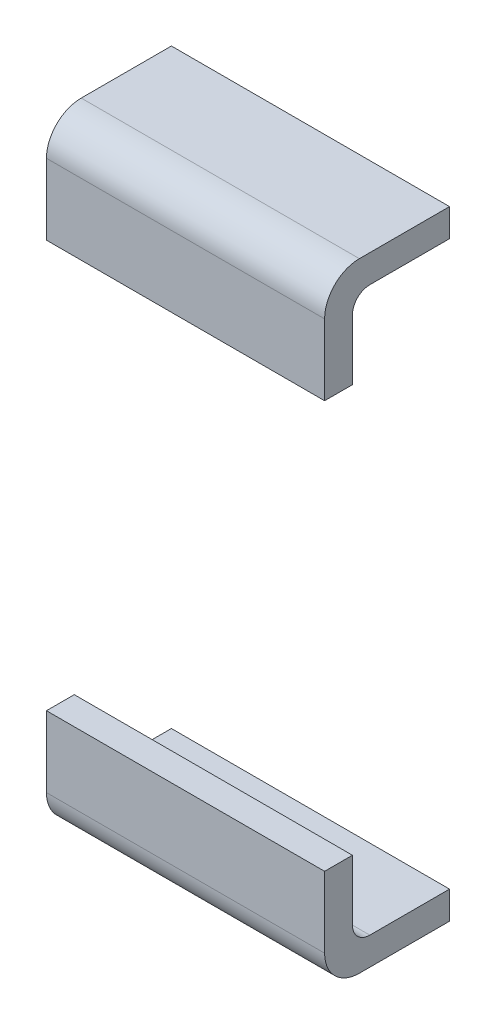
ISO-10303-21;
HEADER;
FILE_DESCRIPTION(('STEP AP214'),'2;1');
FILE_NAME('part.step','',(''),(''),'','','');
FILE_SCHEMA(('AUTOMOTIVE_DESIGN { 1 0 10303 214 1 1 1 1 }'));
ENDSEC;
DATA;
#1=APPLICATION_CONTEXT('core data for automotive mechanical design processes');
#2=APPLICATION_PROTOCOL_DEFINITION('international standard','automotive_design',2000,#1);
#3=PRODUCT_CONTEXT('',#1,'mechanical');
#4=PRODUCT('Part','Part','',(#3));
#5=PRODUCT_RELATED_PRODUCT_CATEGORY('part','',(#4));
#6=PRODUCT_DEFINITION_FORMATION('','',#4);
#7=PRODUCT_DEFINITION_CONTEXT('part definition',#1,'design');
#8=PRODUCT_DEFINITION('design','',#6,#7);
#9=PRODUCT_DEFINITION_SHAPE('','',#8);
#10=(LENGTH_UNIT() NAMED_UNIT(*) SI_UNIT(.MILLI.,.METRE.));
#11=(NAMED_UNIT(*) PLANE_ANGLE_UNIT() SI_UNIT($,.RADIAN.));
#12=(NAMED_UNIT(*) SI_UNIT($,.STERADIAN.) SOLID_ANGLE_UNIT());
#13=UNCERTAINTY_MEASURE_WITH_UNIT(LENGTH_MEASURE(1.E-05),#10,'distance_accuracy_value','');
#14=(GEOMETRIC_REPRESENTATION_CONTEXT(3) GLOBAL_UNCERTAINTY_ASSIGNED_CONTEXT((#13)) GLOBAL_UNIT_ASSIGNED_CONTEXT((#10,
#11,#12)) REPRESENTATION_CONTEXT('',''));
#15=CARTESIAN_POINT('',(0.,0.,0.));
#16=DIRECTION('',(0.,0.,1.));
#17=DIRECTION('',(1.,0.,0.));
#18=AXIS2_PLACEMENT_3D('',#15,#16,#17);
#19=CARTESIAN_POINT('',(14.249999428516,-2.975000642515,-1.811601890916));
#20=DIRECTION('',(0.,8.74227770299797E-08,-0.999999999999996));
#21=DIRECTION('',(0.,0.999999999999996,8.74227770299797E-08));
#22=AXIS2_PLACEMENT_3D('',#19,#20,#21);
#23=PLANE('',#22);
#24=DIRECTION('',(0.999999999999999,-4.37113882867396E-08,0.));
#25=VECTOR('',#24,1.);
#26=CARTESIAN_POINT('',(14.249999404037,-3.535000642515,-1.811601939873));
#27=LINE('',#26,#25);
#28=CARTESIAN_POINT('',(13.249999404037,-3.53500062794474,-1.81160193987292));
#29=VERTEX_POINT('',#28);
#30=CARTESIAN_POINT('',(15.2499994103754,-3.53500068622659,-1.81160193987292));
#31=VERTEX_POINT('',#30);
#32=EDGE_CURVE('P0_E120',#29,#31,#27,.T.);
#33=ORIENTED_EDGE('',*,*,#32,.F.);
#34=DIRECTION('',(0.,0.999999999999996,8.74227770299797E-08));
#35=VECTOR('',#34,1.);
#36=CARTESIAN_POINT('',(13.249999404037,-2.975000642515,-1.811601890916));
#37=LINE('',#36,#35);
#38=CARTESIAN_POINT('',(13.2499994135445,-3.10000059880423,-1.81160190184388));
#39=VERTEX_POINT('',#38);
#40=EDGE_CURVE('P0_E126',#29,#39,#37,.T.);
#41=ORIENTED_EDGE('',*,*,#40,.T.);
#42=DIRECTION('',(-0.999999999999999,4.371138828674E-08,0.));
#43=VECTOR('',#42,1.);
#44=CARTESIAN_POINT('',(14.249999423052,-3.10000064251539,-1.811601901844));
#45=LINE('',#44,#43);
#46=CARTESIAN_POINT('',(15.249999423052,-3.10000064251539,-1.81160190184392));
#47=VERTEX_POINT('',#46);
#48=EDGE_CURVE('P0_E88',#39,#47,#45,.F.);
#49=ORIENTED_EDGE('',*,*,#48,.T.);
#50=DIRECTION('',(0.,0.999999999999996,8.74227770299797E-08));
#51=VECTOR('',#50,1.);
#52=CARTESIAN_POINT('',(15.249999423052,-2.975000642515,-1.811601890916));
#53=LINE('',#52,#51);
#54=EDGE_CURVE('P0_E130',#47,#31,#53,.F.);
#55=ORIENTED_EDGE('',*,*,#54,.T.);
#56=EDGE_LOOP('',(#33,#41,#49,#55));
#57=FACE_BOUND('',#56,.T.);
#58=ADVANCED_FACE('P0_F17',(#57),#23,.T.);
#59=CARTESIAN_POINT('',(14.249999404037,-3.535000642515,-1.811601939873));
#60=DIRECTION('',(-4.37113882867398E-08,-0.999999999999995,-8.74227765734796E-08));
#61=DIRECTION('',(0.,8.74227765734797E-08,-0.999999999999996));
#62=AXIS2_PLACEMENT_3D('',#59,#60,#61);
#63=PLANE('',#62);
#64=ORIENTED_EDGE('',*,*,#32,.T.);
#65=DIRECTION('',(0.,8.74227765734797E-08,-0.999999999999996));
#66=VECTOR('',#65,1.);
#67=CARTESIAN_POINT('',(15.249999404037,-3.53500068622639,-1.811601939873));
#68=LINE('',#67,#66);
#69=CARTESIAN_POINT('',(15.249999404037,-3.53500064542965,-1.611601939873));
#70=VERTEX_POINT('',#69);
#71=EDGE_CURVE('P0_E91',#31,#70,#68,.F.);
#72=ORIENTED_EDGE('',*,*,#71,.T.);
#73=DIRECTION('',(1.,0.,0.));
#74=VECTOR('',#73,1.);
#75=CARTESIAN_POINT('',(14.249999404037,-3.535000616289,-1.611601939873));
#76=LINE('',#75,#74);
#77=CARTESIAN_POINT('',(13.249999418899,-3.53500061628872,-1.611601939873));
#78=VERTEX_POINT('',#77);
#79=EDGE_CURVE('P0_E102',#78,#70,#76,.T.);
#80=ORIENTED_EDGE('',*,*,#79,.F.);
#81=DIRECTION('',(0.,8.74227765734797E-08,-0.999999999999996));
#82=VECTOR('',#81,1.);
#83=CARTESIAN_POINT('',(13.249999404037,-3.53500059880361,-1.811601939873));
#84=LINE('',#83,#82);
#85=EDGE_CURVE('P0_E123',#78,#29,#84,.T.);
#86=ORIENTED_EDGE('',*,*,#85,.T.);
#87=EDGE_LOOP('',(#64,#72,#80,#86));
#88=FACE_BOUND('',#87,.T.);
#89=ADVANCED_FACE('P0_F157',(#88),#63,.T.);
#90=CARTESIAN_POINT('',(14.249999423052,-3.100000631588,-1.936601901844));
#91=DIRECTION('',(-0.999999999999999,4.371138828674E-08,0.));
#92=DIRECTION('',(-4.371138828674E-08,-0.999999999999999,0.));
#93=AXIS2_PLACEMENT_3D('',#90,#91,#92);
#94=CYLINDRICAL_SURFACE('',#93,0.125);
#95=ORIENTED_EDGE('',*,*,#48,.F.);
#96=CARTESIAN_POINT('',(13.2499994230521,-3.10000058787661,-1.936601901844));
#97=DIRECTION('',(-0.999999999999999,4.371138828674E-08,0.));
#98=DIRECTION('',(-4.371138828674E-08,-0.999999999999999,0.));
#99=AXIS2_PLACEMENT_3D('',#96,#97,#98);
#100=CIRCLE('',#99,0.125);
#101=CARTESIAN_POINT('',(13.249999428516,-2.97500058787656,-1.93660189091607));
#102=VERTEX_POINT('',#101);
#103=EDGE_CURVE('P0_E20',#102,#39,#100,.F.);
#104=ORIENTED_EDGE('',*,*,#103,.F.);
#105=DIRECTION('',(0.999999999999999,-4.37113882867396E-08,0.));
#106=VECTOR('',#105,1.);
#107=CARTESIAN_POINT('',(14.249999428516,-2.97500063158795,-1.936601890916));
#108=LINE('',#107,#106);
#109=CARTESIAN_POINT('',(15.2499994285159,-2.97500067529917,-1.93660189638));
#110=VERTEX_POINT('',#109);
#111=EDGE_CURVE('P0_E85',#110,#102,#108,.F.);
#112=ORIENTED_EDGE('',*,*,#111,.F.);
#113=CARTESIAN_POINT('',(15.249999423052,-3.10000067529939,-1.936601901844));
#114=DIRECTION('',(-0.999999999999999,4.371138828674E-08,0.));
#115=DIRECTION('',(-4.371138828674E-08,-0.999999999999999,0.));
#116=AXIS2_PLACEMENT_3D('',#113,#114,#115);
#117=CIRCLE('',#116,0.125);
#118=EDGE_CURVE('P0_E110',#47,#110,#117,.T.);
#119=ORIENTED_EDGE('',*,*,#118,.F.);
#120=EDGE_LOOP('',(#95,#104,#112,#119));
#121=FACE_BOUND('',#120,.T.);
#122=ADVANCED_FACE('P0_F82',(#121),#94,.F.);
#123=CARTESIAN_POINT('',(14.249999404037,-3.53500066,-1.611601939873));
#124=DIRECTION('',(0.,-8.74227765734797E-08,0.999999999999996));
#125=DIRECTION('',(0.,-0.999999999999996,-8.74227765734797E-08));
#126=AXIS2_PLACEMENT_3D('',#123,#124,#125);
#127=PLANE('',#126);
#128=ORIENTED_EDGE('',*,*,#79,.T.);
#129=DIRECTION('',(0.,-0.999999999999996,-8.74227765734797E-08));
#130=VECTOR('',#129,1.);
#131=CARTESIAN_POINT('',(15.249999404037,-3.53500066,-1.611601939873));
#132=LINE('',#131,#130);
#133=CARTESIAN_POINT('',(15.2499994151835,-3.02500070371139,-1.6116018952872));
#134=VERTEX_POINT('',#133);
#135=EDGE_CURVE('P0_E100',#70,#134,#132,.F.);
#136=ORIENTED_EDGE('',*,*,#135,.T.);
#137=DIRECTION('',(-0.999999999999999,4.371138828674E-08,0.));
#138=VECTOR('',#137,1.);
#139=CARTESIAN_POINT('',(14.24999942633,-3.02500066000039,-1.611601895287));
#140=LINE('',#139,#138);
#141=CARTESIAN_POINT('',(13.2499994263301,-3.02500066,-1.61160189528719));
#142=VERTEX_POINT('',#141);
#143=EDGE_CURVE('P0_E95',#142,#134,#140,.F.);
#144=ORIENTED_EDGE('',*,*,#143,.F.);
#145=DIRECTION('',(0.,-0.999999999999996,-8.74227765734797E-08));
#146=VECTOR('',#145,1.);
#147=CARTESIAN_POINT('',(13.24999942633,-3.53500066,-1.611601939873));
#148=LINE('',#147,#146);
#149=EDGE_CURVE('P0_E107',#142,#78,#148,.T.);
#150=ORIENTED_EDGE('',*,*,#149,.T.);
#151=EDGE_LOOP('',(#128,#136,#144,#150));
#152=FACE_BOUND('',#151,.T.);
#153=ADVANCED_FACE('P0_F159',(#152),#127,.T.);
#154=CARTESIAN_POINT('',(14.249999428516,-2.975000581462,-2.509975903453));
#155=DIRECTION('',(-4.37113882867398E-08,-0.999999999999995,-8.74227768824296E-08));
#156=DIRECTION('',(0.,8.74227768824297E-08,-0.999999999999996));
#157=AXIS2_PLACEMENT_3D('',#154,#155,#156);
#158=PLANE('',#157);
#159=DIRECTION('',(1.,0.,0.));
#160=VECTOR('',#159,1.);
#161=CARTESIAN_POINT('',(14.249999437258,-2.975000625173,-2.50997590345356));
#162=LINE('',#161,#160);
#163=CARTESIAN_POINT('',(15.249999434344,-2.97500064188167,-2.50997590345337));
#164=VERTEX_POINT('',#163);
#165=CARTESIAN_POINT('',(13.249999428516,-2.9750005668912,-2.50997589762519));
#166=VERTEX_POINT('',#165);
#167=EDGE_CURVE('P0_E182',#164,#166,#162,.F.);
#168=ORIENTED_EDGE('',*,*,#167,.F.);
#169=DIRECTION('',(0.,0.,1.));
#170=VECTOR('',#169,1.);
#171=CARTESIAN_POINT('',(15.2499994285161,-2.975000675299,-2.060788912921));
#172=LINE('',#171,#170);
#173=EDGE_CURVE('P0_E99',#110,#164,#172,.F.);
#174=ORIENTED_EDGE('',*,*,#173,.F.);
#175=ORIENTED_EDGE('',*,*,#111,.T.);
#176=DIRECTION('',(0.,8.74227768824297E-08,-0.999999999999996));
#177=VECTOR('',#176,1.);
#178=CARTESIAN_POINT('',(13.249999428516,-2.97500053775061,-2.509975903453));
#179=LINE('',#178,#177);
#180=EDGE_CURVE('P0_E92',#102,#166,#179,.T.);
#181=ORIENTED_EDGE('',*,*,#180,.T.);
#182=EDGE_LOOP('',(#168,#174,#175,#181));
#183=FACE_BOUND('',#182,.T.);
#184=ADVANCED_FACE('P0_F97',(#183),#158,.T.);
#185=CARTESIAN_POINT('',(14.24999942633,-3.025000638144,-1.861601895287));
#186=DIRECTION('',(-0.999999999999999,4.371138828674E-08,0.));
#187=DIRECTION('',(-4.371138828674E-08,-0.999999999999999,0.));
#188=AXIS2_PLACEMENT_3D('',#185,#186,#187);
#189=CYLINDRICAL_SURFACE('',#188,0.25);
#190=CARTESIAN_POINT('',(15.24999942633,-3.02500068185539,-1.861601895287));
#191=DIRECTION('',(-0.999999999999999,4.371138828674E-08,0.));
#192=DIRECTION('',(-4.371138828674E-08,-0.999999999999999,0.));
#193=AXIS2_PLACEMENT_3D('',#190,#191,#192);
#194=CIRCLE('',#193,0.25);
#195=CARTESIAN_POINT('',(15.2499994372579,-2.77500068185569,-1.86160187343166));
#196=VERTEX_POINT('',#195);
#197=EDGE_CURVE('P0_E145',#196,#134,#194,.F.);
#198=ORIENTED_EDGE('',*,*,#197,.F.);
#199=DIRECTION('',(0.999999999999999,-4.37113882867396E-08,0.));
#200=VECTOR('',#199,1.);
#201=CARTESIAN_POINT('',(14.249999437258,-2.77500063814431,-1.861601873432));
#202=LINE('',#201,#200);
#203=CARTESIAN_POINT('',(13.249999437258,-2.77500059443292,-1.86160187343165));
#204=VERTEX_POINT('',#203);
#205=EDGE_CURVE('P0_E166',#204,#196,#202,.T.);
#206=ORIENTED_EDGE('',*,*,#205,.F.);
#207=CARTESIAN_POINT('',(13.2499994263302,-3.02500059443261,-1.861601895287));
#208=DIRECTION('',(-0.999999999999999,4.371138828674E-08,0.));
#209=DIRECTION('',(-4.371138828674E-08,-0.999999999999999,0.));
#210=AXIS2_PLACEMENT_3D('',#207,#208,#209);
#211=CIRCLE('',#210,0.25);
#212=EDGE_CURVE('P0_E141',#142,#204,#211,.T.);
#213=ORIENTED_EDGE('',*,*,#212,.F.);
#214=ORIENTED_EDGE('',*,*,#143,.T.);
#215=EDGE_LOOP('',(#198,#206,#213,#214));
#216=FACE_BOUND('',#215,.T.);
#217=ADVANCED_FACE('P0_F164',(#216),#189,.T.);
#218=CARTESIAN_POINT('',(15.249999420648,-3.155000664442,-2.060788912921));
#219=DIRECTION('',(0.999999999999999,-4.371138828674E-08,0.));
#220=DIRECTION('',(4.371138828674E-08,0.999999999999999,0.));
#221=AXIS2_PLACEMENT_3D('',#218,#219,#220);
#222=PLANE('',#221);
#223=DIRECTION('',(0.,0.999999999999996,8.74227758795897E-08));
#224=VECTOR('',#223,1.);
#225=CARTESIAN_POINT('',(15.249999437258,-2.775000581462,-2.509975885969));
#226=LINE('',#225,#224);
#227=CARTESIAN_POINT('',(15.249999437258,-2.77500062517304,-2.509975885969));
#228=VERTEX_POINT('',#227);
#229=EDGE_CURVE('P0_E144',#228,#164,#226,.F.);
#230=ORIENTED_EDGE('',*,*,#229,.F.);
#231=DIRECTION('',(0.,-8.74227765734797E-08,0.999999999999996));
#232=VECTOR('',#231,1.);
#233=CARTESIAN_POINT('',(15.249999437258,-2.77500070371139,-1.611601873432));
#234=LINE('',#233,#232);
#235=EDGE_CURVE('P0_E172',#196,#228,#234,.F.);
#236=ORIENTED_EDGE('',*,*,#235,.F.);
#237=ORIENTED_EDGE('',*,*,#197,.T.);
#238=ORIENTED_EDGE('',*,*,#135,.F.);
#239=ORIENTED_EDGE('',*,*,#71,.F.);
#240=ORIENTED_EDGE('',*,*,#54,.F.);
#241=ORIENTED_EDGE('',*,*,#118,.T.);
#242=ORIENTED_EDGE('',*,*,#173,.T.);
#243=EDGE_LOOP('',(#230,#236,#237,#238,#239,#240,#241,#242));
#244=FACE_BOUND('',#243,.T.);
#245=ADVANCED_FACE('P0_F148',(#244),#222,.T.);
#246=CARTESIAN_POINT('',(14.249999437258,-2.775000581462,-2.509975885969));
#247=DIRECTION('',(0.,8.74227758795897E-08,-0.999999999999996));
#248=DIRECTION('',(0.,0.999999999999996,8.74227758795897E-08));
#249=AXIS2_PLACEMENT_3D('',#246,#247,#248);
#250=PLANE('',#249);
#251=DIRECTION('',(0.999999999999999,-4.37113882867396E-08,0.));
#252=VECTOR('',#251,1.);
#253=CARTESIAN_POINT('',(14.249999437258,-2.77500058146165,-2.509975885969));
#254=LINE('',#253,#252);
#255=CARTESIAN_POINT('',(13.2499994372581,-2.77500053775026,-2.509975885969));
#256=VERTEX_POINT('',#255);
#257=EDGE_CURVE('P0_E26',#228,#256,#254,.F.);
#258=ORIENTED_EDGE('',*,*,#257,.F.);
#259=ORIENTED_EDGE('',*,*,#229,.T.);
#260=ORIENTED_EDGE('',*,*,#167,.T.);
#261=DIRECTION('',(-4.371138828674E-08,-0.999999999999999,0.));
#262=VECTOR('',#261,1.);
#263=CARTESIAN_POINT('',(13.249999420648,-3.155000577019,-2.509975885969));
#264=LINE('',#263,#262);
#265=EDGE_CURVE('P0_E35',#256,#166,#264,.T.);
#266=ORIENTED_EDGE('',*,*,#265,.F.);
#267=EDGE_LOOP('',(#258,#259,#260,#266));
#268=FACE_BOUND('',#267,.T.);
#269=ADVANCED_FACE('P0_F192',(#268),#250,.T.);
#270=CARTESIAN_POINT('',(13.249999420648,-3.155000577019,-2.060788912921));
#271=DIRECTION('',(-0.999999999999999,4.371138828674E-08,0.));
#272=DIRECTION('',(-4.371138828674E-08,-0.999999999999999,0.));
#273=AXIS2_PLACEMENT_3D('',#270,#271,#272);
#274=PLANE('',#273);
#275=ORIENTED_EDGE('',*,*,#85,.F.);
#276=ORIENTED_EDGE('',*,*,#149,.F.);
#277=ORIENTED_EDGE('',*,*,#212,.T.);
#278=DIRECTION('',(0.,-8.74227765734797E-08,0.999999999999996));
#279=VECTOR('',#278,1.);
#280=CARTESIAN_POINT('',(13.249999437258,-2.77500061628861,-1.611601873432));
#281=LINE('',#280,#279);
#282=EDGE_CURVE('P0_E11',#256,#204,#281,.T.);
#283=ORIENTED_EDGE('',*,*,#282,.F.);
#284=ORIENTED_EDGE('',*,*,#265,.T.);
#285=ORIENTED_EDGE('',*,*,#180,.F.);
#286=ORIENTED_EDGE('',*,*,#103,.T.);
#287=ORIENTED_EDGE('',*,*,#40,.F.);
#288=EDGE_LOOP('',(#275,#276,#277,#283,#284,#285,#286,#287));
#289=FACE_BOUND('',#288,.T.);
#290=ADVANCED_FACE('P0_F93',(#289),#274,.T.);
#291=CARTESIAN_POINT('',(14.249999437258,-2.77500066,-1.611601873432));
#292=DIRECTION('',(4.37113882867398E-08,0.999999999999995,8.74227765734796E-08));
#293=DIRECTION('',(0.,-8.74227765734797E-08,0.999999999999996));
#294=AXIS2_PLACEMENT_3D('',#291,#292,#293);
#295=PLANE('',#294);
#296=ORIENTED_EDGE('',*,*,#257,.T.);
#297=ORIENTED_EDGE('',*,*,#282,.T.);
#298=ORIENTED_EDGE('',*,*,#205,.T.);
#299=ORIENTED_EDGE('',*,*,#235,.T.);
#300=EDGE_LOOP('',(#296,#297,#298,#299));
#301=FACE_BOUND('',#300,.T.);
#302=ADVANCED_FACE('P0_F169',(#301),#295,.T.);
#303=CLOSED_SHELL('',(#58,#89,#122,#153,#184,#217,#245,#269,#290,#302));
#304=MANIFOLD_SOLID_BREP('P0_B1',#303);
#305=CARTESIAN_POINT('',(14.249999251484,-7.025000642515,-1.811602244979));
#306=DIRECTION('',(0.,-8.74227761169697E-08,0.999999999999996));
#307=DIRECTION('',(0.,-0.999999999999996,-8.74227761169697E-08));
#308=AXIS2_PLACEMENT_3D('',#305,#306,#307);
#309=PLANE('',#308);
#310=DIRECTION('',(0.,-0.999999999999996,-8.74227761169697E-08));
#311=VECTOR('',#310,1.);
#312=CARTESIAN_POINT('',(13.249999275963,-7.025000642515,-1.811602244979));
#313=LINE('',#312,#311);
#314=CARTESIAN_POINT('',(13.249999275963,-6.46500059880361,-1.81160219602208));
#315=VERTEX_POINT('',#314);
#316=CARTESIAN_POINT('',(13.2499992664555,-6.90000059880411,-1.81160223405107));
#317=VERTEX_POINT('',#316);
#318=EDGE_CURVE('P1_E57',#315,#317,#313,.T.);
#319=ORIENTED_EDGE('',*,*,#318,.F.);
#320=DIRECTION('',(0.999999999999999,-4.37113882867396E-08,0.));
#321=VECTOR('',#320,1.);
#322=CARTESIAN_POINT('',(14.249999275963,-6.465000642515,-1.811602196022));
#323=LINE('',#322,#321);
#324=CARTESIAN_POINT('',(15.2499992696246,-6.46500068622659,-1.81160219602209));
#325=VERTEX_POINT('',#324);
#326=EDGE_CURVE('P1_E126',#315,#325,#323,.T.);
#327=ORIENTED_EDGE('',*,*,#326,.T.);
#328=DIRECTION('',(0.,-0.999999999999996,-8.74227761169697E-08));
#329=VECTOR('',#328,1.);
#330=CARTESIAN_POINT('',(15.249999256948,-7.025000642515,-1.811602244979));
#331=LINE('',#330,#329);
#332=CARTESIAN_POINT('',(15.249999256948,-6.9000006425155,-1.81160223405108));
#333=VERTEX_POINT('',#332);
#334=EDGE_CURVE('P1_E135',#333,#325,#331,.F.);
#335=ORIENTED_EDGE('',*,*,#334,.F.);
#336=DIRECTION('',(0.999999999999999,-4.371138828674E-08,0.));
#337=VECTOR('',#336,1.);
#338=CARTESIAN_POINT('',(14.249999256948,-6.90000064251561,-1.811602234051));
#339=LINE('',#338,#337);
#340=EDGE_CURVE('P1_E116',#333,#317,#339,.F.);
#341=ORIENTED_EDGE('',*,*,#340,.T.);
#342=EDGE_LOOP('',(#319,#327,#335,#341));
#343=FACE_BOUND('',#342,.T.);
#344=ADVANCED_FACE('P1_F17',(#343),#309,.F.);
#345=CARTESIAN_POINT('',(14.249999256948,-6.900000631588,-1.936602234051));
#346=DIRECTION('',(0.999999999999999,-4.371138828674E-08,0.));
#347=DIRECTION('',(4.371138828674E-08,0.999999999999999,0.));
#348=AXIS2_PLACEMENT_3D('',#345,#346,#347);
#349=CYLINDRICAL_SURFACE('',#348,0.125);
#350=DIRECTION('',(0.999999999999999,-4.37113882867396E-08,0.));
#351=VECTOR('',#350,1.);
#352=CARTESIAN_POINT('',(14.249999251484,-7.02500063158795,-1.936602244979));
#353=LINE('',#352,#351);
#354=CARTESIAN_POINT('',(15.249999251484,-7.02500067529917,-1.936602239515));
#355=VERTEX_POINT('',#354);
#356=CARTESIAN_POINT('',(13.249999251484,-7.02500058787656,-1.93660224497892));
#357=VERTEX_POINT('',#356);
#358=EDGE_CURVE('P1_E106',#355,#357,#353,.F.);
#359=ORIENTED_EDGE('',*,*,#358,.T.);
#360=CARTESIAN_POINT('',(13.249999256948,-6.90000058787661,-1.936602234051));
#361=DIRECTION('',(0.999999999999999,-4.371138828674E-08,0.));
#362=DIRECTION('',(4.371138828674E-08,0.999999999999999,0.));
#363=AXIS2_PLACEMENT_3D('',#360,#361,#362);
#364=CIRCLE('',#363,0.125);
#365=EDGE_CURVE('P1_E20',#317,#357,#364,.T.);
#366=ORIENTED_EDGE('',*,*,#365,.F.);
#367=ORIENTED_EDGE('',*,*,#340,.F.);
#368=CARTESIAN_POINT('',(15.2499992569479,-6.90000067529939,-1.936602234051));
#369=DIRECTION('',(0.999999999999999,-4.371138828674E-08,0.));
#370=DIRECTION('',(4.371138828674E-08,0.999999999999999,0.));
#371=AXIS2_PLACEMENT_3D('',#368,#369,#370);
#372=CIRCLE('',#371,0.125);
#373=EDGE_CURVE('P1_E115',#355,#333,#372,.F.);
#374=ORIENTED_EDGE('',*,*,#373,.F.);
#375=EDGE_LOOP('',(#359,#366,#367,#374));
#376=FACE_BOUND('',#375,.T.);
#377=ADVANCED_FACE('P1_F117',(#376),#349,.F.);
#378=CARTESIAN_POINT('',(14.249999275963,-6.465000642515,-1.811602196022));
#379=DIRECTION('',(-4.37113882867398E-08,-0.999999999999995,-8.74227765734796E-08));
#380=DIRECTION('',(0.,8.74227765734797E-08,-0.999999999999996));
#381=AXIS2_PLACEMENT_3D('',#378,#379,#380);
#382=PLANE('',#381);
#383=DIRECTION('',(0.,8.74227765734797E-08,-0.999999999999996));
#384=VECTOR('',#383,1.);
#385=CARTESIAN_POINT('',(15.249999275963,-6.46500068622639,-1.811602196022));
#386=LINE('',#385,#384);
#387=CARTESIAN_POINT('',(15.2499992759628,-6.46500067457032,-1.61160221088367));
#388=VERTEX_POINT('',#387);
#389=EDGE_CURVE('P1_E101',#325,#388,#386,.F.);
#390=ORIENTED_EDGE('',*,*,#389,.F.);
#391=ORIENTED_EDGE('',*,*,#326,.F.);
#392=DIRECTION('',(0.,8.74227765734797E-08,-0.999999999999996));
#393=VECTOR('',#392,1.);
#394=CARTESIAN_POINT('',(13.249999275963,-6.46500059880361,-1.811602196022));
#395=LINE('',#394,#393);
#396=CARTESIAN_POINT('',(13.2499992759626,-6.46500061046039,-1.611602196022));
#397=VERTEX_POINT('',#396);
#398=EDGE_CURVE('P1_E91',#397,#315,#395,.T.);
#399=ORIENTED_EDGE('',*,*,#398,.F.);
#400=DIRECTION('',(1.,0.,0.));
#401=VECTOR('',#400,1.);
#402=CARTESIAN_POINT('',(14.249999275963,-6.465000616289,-1.611602196022));
#403=LINE('',#402,#401);
#404=EDGE_CURVE('P1_E119',#397,#388,#403,.T.);
#405=ORIENTED_EDGE('',*,*,#404,.T.);
#406=EDGE_LOOP('',(#390,#391,#399,#405));
#407=FACE_BOUND('',#406,.T.);
#408=ADVANCED_FACE('P1_F212',(#407),#382,.F.);
#409=CARTESIAN_POINT('',(14.249999251484,-7.025000581462,-2.509976257516));
#410=DIRECTION('',(-4.37113882867398E-08,-0.999999999999995,-8.74227762645196E-08));
#411=DIRECTION('',(0.,8.74227762645197E-08,-0.999999999999996));
#412=AXIS2_PLACEMENT_3D('',#409,#410,#411);
#413=PLANE('',#412);
#414=DIRECTION('',(0.,0.,1.));
#415=VECTOR('',#414,1.);
#416=CARTESIAN_POINT('',(15.249999251484,-7.025000675299,-2.060789235511));
#417=LINE('',#416,#415);
#418=CARTESIAN_POINT('',(15.249999245656,-7.02500064188167,-2.50997625751563));
#419=VERTEX_POINT('',#418);
#420=EDGE_CURVE('P1_E149',#355,#419,#417,.F.);
#421=ORIENTED_EDGE('',*,*,#420,.T.);
#422=DIRECTION('',(1.,0.,0.));
#423=VECTOR('',#422,1.);
#424=CARTESIAN_POINT('',(14.249999242742,-7.025000625173,-2.50997625751545));
#425=LINE('',#424,#423);
#426=CARTESIAN_POINT('',(13.249999251484,-7.0250005668912,-2.50997626334382));
#427=VERTEX_POINT('',#426);
#428=EDGE_CURVE('P1_E109',#419,#427,#425,.F.);
#429=ORIENTED_EDGE('',*,*,#428,.T.);
#430=DIRECTION('',(0.,8.74227762645197E-08,-0.999999999999996));
#431=VECTOR('',#430,1.);
#432=CARTESIAN_POINT('',(13.249999251484,-7.02500053775061,-2.509976257516));
#433=LINE('',#432,#431);
#434=EDGE_CURVE('P1_E95',#357,#427,#433,.T.);
#435=ORIENTED_EDGE('',*,*,#434,.F.);
#436=ORIENTED_EDGE('',*,*,#358,.F.);
#437=EDGE_LOOP('',(#421,#429,#435,#436));
#438=FACE_BOUND('',#437,.T.);
#439=ADVANCED_FACE('P1_F104',(#438),#413,.F.);
#440=CARTESIAN_POINT('',(14.249999275963,-6.46500066,-1.611602196022));
#441=DIRECTION('',(0.,8.74227765734797E-08,-0.999999999999996));
#442=DIRECTION('',(0.,0.999999999999996,8.74227765734797E-08));
#443=AXIS2_PLACEMENT_3D('',#440,#441,#442);
#444=PLANE('',#443);
#445=DIRECTION('',(-4.371138828674E-08,-0.999999999999999,0.));
#446=VECTOR('',#445,1.);
#447=CARTESIAN_POINT('',(15.249999259352,-6.845000664442,-1.611602240607));
#448=LINE('',#447,#446);
#449=CARTESIAN_POINT('',(15.2499992536697,-6.97500069278319,-1.611602240607));
#450=VERTEX_POINT('',#449);
#451=EDGE_CURVE('P1_E79',#450,#388,#448,.F.);
#452=ORIENTED_EDGE('',*,*,#451,.T.);
#453=ORIENTED_EDGE('',*,*,#404,.F.);
#454=DIRECTION('',(4.371138828674E-08,0.999999999999999,0.));
#455=VECTOR('',#454,1.);
#456=CARTESIAN_POINT('',(13.249999259352,-6.845000577019,-1.611602196022));
#457=LINE('',#456,#455);
#458=CARTESIAN_POINT('',(13.24999925367,-6.97500060536042,-1.6116022183145));
#459=VERTEX_POINT('',#458);
#460=EDGE_CURVE('P1_E86',#397,#459,#457,.F.);
#461=ORIENTED_EDGE('',*,*,#460,.T.);
#462=DIRECTION('',(0.999999999999999,-4.371138828674E-08,0.));
#463=VECTOR('',#462,1.);
#464=CARTESIAN_POINT('',(14.24999925367,-6.97500065999961,-1.611602240607));
#465=LINE('',#464,#463);
#466=EDGE_CURVE('P1_E145',#450,#459,#465,.F.);
#467=ORIENTED_EDGE('',*,*,#466,.F.);
#468=EDGE_LOOP('',(#452,#453,#461,#467));
#469=FACE_BOUND('',#468,.T.);
#470=ADVANCED_FACE('P1_F200',(#469),#444,.F.);
#471=CARTESIAN_POINT('',(15.249999259352,-6.845000664442,-2.060789235511));
#472=DIRECTION('',(-0.999999999999999,4.371138828674E-08,0.));
#473=DIRECTION('',(-4.371138828674E-08,-0.999999999999999,0.));
#474=AXIS2_PLACEMENT_3D('',#471,#472,#473);
#475=PLANE('',#474);
#476=DIRECTION('',(0.,-8.74227765734797E-08,0.999999999999996));
#477=VECTOR('',#476,1.);
#478=CARTESIAN_POINT('',(15.249999242742,-7.22500070371139,-1.611602262463));
#479=LINE('',#478,#477);
#480=CARTESIAN_POINT('',(15.249999242742,-7.2250006818557,-1.86160226246285));
#481=VERTEX_POINT('',#480);
#482=CARTESIAN_POINT('',(15.249999242742,-7.22500062517304,-2.509976275));
#483=VERTEX_POINT('',#482);
#484=EDGE_CURVE('P1_E163',#481,#483,#479,.F.);
#485=ORIENTED_EDGE('',*,*,#484,.T.);
#486=DIRECTION('',(0.,-0.999999999999996,-8.74227772673597E-08));
#487=VECTOR('',#486,1.);
#488=CARTESIAN_POINT('',(15.249999242742,-7.225000581462,-2.509976275));
#489=LINE('',#488,#487);
#490=EDGE_CURVE('P1_E151',#483,#419,#489,.F.);
#491=ORIENTED_EDGE('',*,*,#490,.T.);
#492=ORIENTED_EDGE('',*,*,#420,.F.);
#493=ORIENTED_EDGE('',*,*,#373,.T.);
#494=ORIENTED_EDGE('',*,*,#334,.T.);
#495=ORIENTED_EDGE('',*,*,#389,.T.);
#496=ORIENTED_EDGE('',*,*,#451,.F.);
#497=CARTESIAN_POINT('',(15.2499992536698,-6.97500068185539,-1.861602240607));
#498=DIRECTION('',(0.999999999999999,-4.371138828674E-08,0.));
#499=DIRECTION('',(4.371138828674E-08,0.999999999999999,0.));
#500=AXIS2_PLACEMENT_3D('',#497,#498,#499);
#501=CIRCLE('',#500,0.25);
#502=EDGE_CURVE('P1_E143',#481,#450,#501,.F.);
#503=ORIENTED_EDGE('',*,*,#502,.F.);
#504=EDGE_LOOP('',(#485,#491,#492,#493,#494,#495,#496,#503));
#505=FACE_BOUND('',#504,.T.);
#506=ADVANCED_FACE('P1_F147',(#505),#475,.F.);
#507=CARTESIAN_POINT('',(14.249999242742,-7.225000581462,-2.509976275));
#508=DIRECTION('',(0.,-8.74227772673597E-08,0.999999999999996));
#509=DIRECTION('',(0.,-0.999999999999996,-8.74227772673597E-08));
#510=AXIS2_PLACEMENT_3D('',#507,#508,#509);
#511=PLANE('',#510);
#512=ORIENTED_EDGE('',*,*,#490,.F.);
#513=DIRECTION('',(0.999999999999999,-4.37113882867396E-08,0.));
#514=VECTOR('',#513,1.);
#515=CARTESIAN_POINT('',(14.249999242742,-7.22500058146165,-2.509976275));
#516=LINE('',#515,#514);
#517=CARTESIAN_POINT('',(13.2499992427419,-7.22500053775026,-2.509976275));
#518=VERTEX_POINT('',#517);
#519=EDGE_CURVE('P1_E180',#483,#518,#516,.F.);
#520=ORIENTED_EDGE('',*,*,#519,.T.);
#521=DIRECTION('',(4.371138828674E-08,0.999999999999999,0.));
#522=VECTOR('',#521,1.);
#523=CARTESIAN_POINT('',(13.249999259352,-6.845000577019,-2.509976275));
#524=LINE('',#523,#522);
#525=EDGE_CURVE('P1_E168',#518,#427,#524,.T.);
#526=ORIENTED_EDGE('',*,*,#525,.T.);
#527=ORIENTED_EDGE('',*,*,#428,.F.);
#528=EDGE_LOOP('',(#512,#520,#526,#527));
#529=FACE_BOUND('',#528,.T.);
#530=ADVANCED_FACE('P1_F190',(#529),#511,.F.);
#531=CARTESIAN_POINT('',(13.249999259352,-6.845000577019,-2.060789235511));
#532=DIRECTION('',(0.999999999999999,-4.371138828674E-08,0.));
#533=DIRECTION('',(4.371138828674E-08,0.999999999999999,0.));
#534=AXIS2_PLACEMENT_3D('',#531,#532,#533);
#535=PLANE('',#534);
#536=ORIENTED_EDGE('',*,*,#460,.F.);
#537=ORIENTED_EDGE('',*,*,#398,.T.);
#538=ORIENTED_EDGE('',*,*,#318,.T.);
#539=ORIENTED_EDGE('',*,*,#365,.T.);
#540=ORIENTED_EDGE('',*,*,#434,.T.);
#541=ORIENTED_EDGE('',*,*,#525,.F.);
#542=DIRECTION('',(0.,-8.74227765734797E-08,0.999999999999996));
#543=VECTOR('',#542,1.);
#544=CARTESIAN_POINT('',(13.249999242742,-7.22500061628861,-1.611602262463));
#545=LINE('',#544,#543);
#546=CARTESIAN_POINT('',(13.2499992427421,-7.22500059443292,-1.86160226246285));
#547=VERTEX_POINT('',#546);
#548=EDGE_CURVE('P1_E26',#518,#547,#545,.T.);
#549=ORIENTED_EDGE('',*,*,#548,.T.);
#550=CARTESIAN_POINT('',(13.24999925367,-6.97500059443261,-1.861602240607));
#551=DIRECTION('',(0.999999999999999,-4.371138828674E-08,0.));
#552=DIRECTION('',(4.371138828674E-08,0.999999999999999,0.));
#553=AXIS2_PLACEMENT_3D('',#550,#551,#552);
#554=CIRCLE('',#553,0.25);
#555=EDGE_CURVE('P1_E34',#459,#547,#554,.T.);
#556=ORIENTED_EDGE('',*,*,#555,.F.);
#557=EDGE_LOOP('',(#536,#537,#538,#539,#540,#541,#549,#556));
#558=FACE_BOUND('',#557,.T.);
#559=ADVANCED_FACE('P1_F112',(#558),#535,.F.);
#560=CARTESIAN_POINT('',(14.24999925367,-6.975000638144,-1.861602240607));
#561=DIRECTION('',(0.999999999999999,-4.371138828674E-08,0.));
#562=DIRECTION('',(4.371138828674E-08,0.999999999999999,0.));
#563=AXIS2_PLACEMENT_3D('',#560,#561,#562);
#564=CYLINDRICAL_SURFACE('',#563,0.25);
#565=ORIENTED_EDGE('',*,*,#502,.T.);
#566=ORIENTED_EDGE('',*,*,#466,.T.);
#567=ORIENTED_EDGE('',*,*,#555,.T.);
#568=DIRECTION('',(0.999999999999999,-4.37113882867396E-08,0.));
#569=VECTOR('',#568,1.);
#570=CARTESIAN_POINT('',(14.249999242742,-7.22500063814431,-1.861602262463));
#571=LINE('',#570,#569);
#572=EDGE_CURVE('P1_E11',#547,#481,#571,.T.);
#573=ORIENTED_EDGE('',*,*,#572,.T.);
#574=EDGE_LOOP('',(#565,#566,#567,#573));
#575=FACE_BOUND('',#574,.T.);
#576=ADVANCED_FACE('P1_F198',(#575),#564,.T.);
#577=CARTESIAN_POINT('',(14.249999242742,-7.22500066,-1.611602262463));
#578=DIRECTION('',(4.37113882867398E-08,0.999999999999995,8.74227765734796E-08));
#579=DIRECTION('',(0.,-8.74227765734797E-08,0.999999999999996));
#580=AXIS2_PLACEMENT_3D('',#577,#578,#579);
#581=PLANE('',#580);
#582=ORIENTED_EDGE('',*,*,#548,.F.);
#583=ORIENTED_EDGE('',*,*,#519,.F.);
#584=ORIENTED_EDGE('',*,*,#484,.F.);
#585=ORIENTED_EDGE('',*,*,#572,.F.);
#586=EDGE_LOOP('',(#582,#583,#584,#585));
#587=FACE_BOUND('',#586,.T.);
#588=ADVANCED_FACE('P1_F188',(#587),#581,.F.);
#589=CLOSED_SHELL('',(#344,#377,#408,#439,#470,#506,#530,#559,#576,#588));
#590=MANIFOLD_SOLID_BREP('P1_B1',#589);
#591=ADVANCED_BREP_SHAPE_REPRESENTATION('',(#18,#304,#590),#14);
#592=SHAPE_DEFINITION_REPRESENTATION(#9,#591);
ENDSEC;
END-ISO-10303-21;
